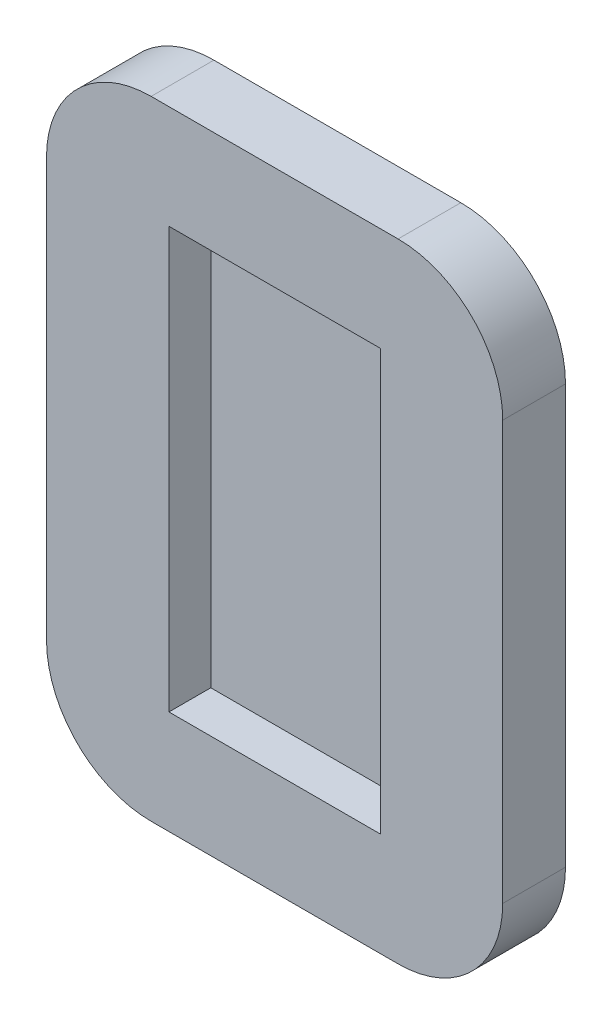
ISO-10303-21;
HEADER;
FILE_DESCRIPTION(('STEP AP214'),'2;1');
FILE_NAME('part.step','',(''),(''),'','','');
FILE_SCHEMA(('AUTOMOTIVE_DESIGN { 1 0 10303 214 1 1 1 1 }'));
ENDSEC;
DATA;
#1=APPLICATION_CONTEXT('core data for automotive mechanical design processes');
#2=APPLICATION_PROTOCOL_DEFINITION('international standard','automotive_design',2000,#1);
#3=PRODUCT_CONTEXT('',#1,'mechanical');
#4=PRODUCT('Part','Part','',(#3));
#5=PRODUCT_RELATED_PRODUCT_CATEGORY('part','',(#4));
#6=PRODUCT_DEFINITION_FORMATION('','',#4);
#7=PRODUCT_DEFINITION_CONTEXT('part definition',#1,'design');
#8=PRODUCT_DEFINITION('design','',#6,#7);
#9=PRODUCT_DEFINITION_SHAPE('','',#8);
#10=(LENGTH_UNIT() NAMED_UNIT(*) SI_UNIT(.MILLI.,.METRE.));
#11=(NAMED_UNIT(*) PLANE_ANGLE_UNIT() SI_UNIT($,.RADIAN.));
#12=(NAMED_UNIT(*) SI_UNIT($,.STERADIAN.) SOLID_ANGLE_UNIT());
#13=UNCERTAINTY_MEASURE_WITH_UNIT(LENGTH_MEASURE(1.E-05),#10,'distance_accuracy_value','');
#14=(GEOMETRIC_REPRESENTATION_CONTEXT(3) GLOBAL_UNCERTAINTY_ASSIGNED_CONTEXT((#13)) GLOBAL_UNIT_ASSIGNED_CONTEXT((#10,
#11,#12)) REPRESENTATION_CONTEXT('',''));
#15=CARTESIAN_POINT('',(0.,0.,0.));
#16=DIRECTION('',(0.,0.,1.));
#17=DIRECTION('',(1.,0.,0.));
#18=AXIS2_PLACEMENT_3D('',#15,#16,#17);
#19=CARTESIAN_POINT('',(21.8,0.,0.));
#20=DIRECTION('',(0.,-1.,0.));
#21=DIRECTION('',(0.,0.,-1.));
#22=AXIS2_PLACEMENT_3D('',#19,#20,#21);
#23=PLANE('',#22);
#24=DIRECTION('',(0.,0.,1.));
#25=VECTOR('',#24,1.);
#26=CARTESIAN_POINT('',(16.8,0.,0.));
#27=LINE('',#26,#25);
#28=CARTESIAN_POINT('',(16.8,0.,21.8));
#29=VERTEX_POINT('',#28);
#30=CARTESIAN_POINT('',(16.8,0.,18.8));
#31=VERTEX_POINT('',#30);
#32=EDGE_CURVE('E50',#29,#31,#27,.F.);
#33=ORIENTED_EDGE('',*,*,#32,.T.);
#34=DIRECTION('',(-1.,0.,0.));
#35=VECTOR('',#34,1.);
#36=CARTESIAN_POINT('',(57.2039545813741,0.,18.8));
#37=LINE('',#36,#35);
#38=CARTESIAN_POINT('',(5.,0.,18.8));
#39=VERTEX_POINT('',#38);
#40=EDGE_CURVE('E139',#31,#39,#37,.T.);
#41=ORIENTED_EDGE('',*,*,#40,.T.);
#42=DIRECTION('',(0.,0.,1.));
#43=VECTOR('',#42,1.);
#44=CARTESIAN_POINT('',(5.,0.,0.));
#45=LINE('',#44,#43);
#46=CARTESIAN_POINT('',(5.,0.,21.8));
#47=VERTEX_POINT('',#46);
#48=EDGE_CURVE('E171',#39,#47,#45,.T.);
#49=ORIENTED_EDGE('',*,*,#48,.T.);
#50=DIRECTION('',(-1.,0.,0.));
#51=VECTOR('',#50,1.);
#52=CARTESIAN_POINT('',(21.8,0.,21.8));
#53=LINE('',#52,#51);
#54=EDGE_CURVE('E181',#29,#47,#53,.T.);
#55=ORIENTED_EDGE('',*,*,#54,.F.);
#56=EDGE_LOOP('',(#33,#41,#49,#55));
#57=FACE_BOUND('',#56,.T.);
#58=ADVANCED_FACE('F41',(#57),#23,.F.);
#59=CARTESIAN_POINT('',(21.8,-30.,0.));
#60=DIRECTION('',(0.,-1.,0.));
#61=DIRECTION('',(0.,0.,-1.));
#62=AXIS2_PLACEMENT_3D('',#59,#60,#61);
#63=PLANE('',#62);
#64=DIRECTION('',(-1.,0.,0.));
#65=VECTOR('',#64,1.);
#66=CARTESIAN_POINT('',(57.2039545813741,-30.,18.8));
#67=LINE('',#66,#65);
#68=CARTESIAN_POINT('',(16.8,-30.,18.8));
#69=VERTEX_POINT('',#68);
#70=CARTESIAN_POINT('',(5.,-30.,18.8));
#71=VERTEX_POINT('',#70);
#72=EDGE_CURVE('E140',#69,#71,#67,.T.);
#73=ORIENTED_EDGE('',*,*,#72,.F.);
#74=DIRECTION('',(0.,0.,1.));
#75=VECTOR('',#74,1.);
#76=CARTESIAN_POINT('',(16.8,-30.,0.));
#77=LINE('',#76,#75);
#78=CARTESIAN_POINT('',(16.8,-30.,21.8));
#79=VERTEX_POINT('',#78);
#80=EDGE_CURVE('E148',#69,#79,#77,.T.);
#81=ORIENTED_EDGE('',*,*,#80,.T.);
#82=DIRECTION('',(-1.,0.,0.));
#83=VECTOR('',#82,1.);
#84=CARTESIAN_POINT('',(21.8,-30.,21.8));
#85=LINE('',#84,#83);
#86=CARTESIAN_POINT('',(5.,-30.,21.8));
#87=VERTEX_POINT('',#86);
#88=EDGE_CURVE('E239',#79,#87,#85,.T.);
#89=ORIENTED_EDGE('',*,*,#88,.T.);
#90=DIRECTION('',(0.,0.,1.));
#91=VECTOR('',#90,1.);
#92=CARTESIAN_POINT('',(5.,-30.,0.));
#93=LINE('',#92,#91);
#94=EDGE_CURVE('E248',#87,#71,#93,.F.);
#95=ORIENTED_EDGE('',*,*,#94,.T.);
#96=EDGE_LOOP('',(#73,#81,#89,#95));
#97=FACE_BOUND('',#96,.T.);
#98=ADVANCED_FACE('F268',(#97),#63,.T.);
#99=CARTESIAN_POINT('',(21.8,0.,21.8));
#100=DIRECTION('',(0.,0.,-1.));
#101=DIRECTION('',(0.,1.,0.));
#102=AXIS2_PLACEMENT_3D('',#99,#100,#101);
#103=PLANE('',#102);
#104=DIRECTION('',(-1.,0.,0.));
#105=VECTOR('',#104,1.);
#106=CARTESIAN_POINT('',(5.84999999999999,-4.95,21.8));
#107=LINE('',#106,#105);
#108=CARTESIAN_POINT('',(15.95,-4.95,21.8));
#109=VERTEX_POINT('',#108);
#110=CARTESIAN_POINT('',(5.84999999999999,-4.95,21.8));
#111=VERTEX_POINT('',#110);
#112=EDGE_CURVE('E214',#109,#111,#107,.T.);
#113=ORIENTED_EDGE('',*,*,#112,.F.);
#114=DIRECTION('',(0.,1.,0.));
#115=VECTOR('',#114,1.);
#116=CARTESIAN_POINT('',(15.95,-4.95,21.8));
#117=LINE('',#116,#115);
#118=CARTESIAN_POINT('',(15.95,-25.05,21.8));
#119=VERTEX_POINT('',#118);
#120=EDGE_CURVE('E64',#119,#109,#117,.T.);
#121=ORIENTED_EDGE('',*,*,#120,.F.);
#122=DIRECTION('',(1.,0.,0.));
#123=VECTOR('',#122,1.);
#124=CARTESIAN_POINT('',(5.84999999999999,-25.05,21.8));
#125=LINE('',#124,#123);
#126=CARTESIAN_POINT('',(5.84999999999999,-25.05,21.8));
#127=VERTEX_POINT('',#126);
#128=EDGE_CURVE('E199',#127,#119,#125,.T.);
#129=ORIENTED_EDGE('',*,*,#128,.F.);
#130=DIRECTION('',(0.,-1.,0.));
#131=VECTOR('',#130,1.);
#132=CARTESIAN_POINT('',(5.84999999999999,-4.95,21.8));
#133=LINE('',#132,#131);
#134=EDGE_CURVE('E218',#111,#127,#133,.T.);
#135=ORIENTED_EDGE('',*,*,#134,.F.);
#136=EDGE_LOOP('',(#113,#121,#129,#135));
#137=FACE_BOUND('',#136,.T.);
#138=ORIENTED_EDGE('',*,*,#88,.F.);
#139=CARTESIAN_POINT('',(16.8,-25.,21.8));
#140=DIRECTION('',(0.,0.,-1.));
#141=DIRECTION('',(0.,1.,0.));
#142=AXIS2_PLACEMENT_3D('',#139,#140,#141);
#143=CIRCLE('',#142,5.);
#144=CARTESIAN_POINT('',(21.8,-25.,21.8));
#145=VERTEX_POINT('',#144);
#146=EDGE_CURVE('E165',#79,#145,#143,.F.);
#147=ORIENTED_EDGE('',*,*,#146,.T.);
#148=DIRECTION('',(0.,-1.,0.));
#149=VECTOR('',#148,1.);
#150=CARTESIAN_POINT('',(21.8,0.,21.8));
#151=LINE('',#150,#149);
#152=CARTESIAN_POINT('',(21.8,-5.,21.8));
#153=VERTEX_POINT('',#152);
#154=EDGE_CURVE('E155',#153,#145,#151,.T.);
#155=ORIENTED_EDGE('',*,*,#154,.F.);
#156=CARTESIAN_POINT('',(16.8,-5.,21.8));
#157=DIRECTION('',(0.,0.,-1.));
#158=DIRECTION('',(0.,1.,0.));
#159=AXIS2_PLACEMENT_3D('',#156,#157,#158);
#160=CIRCLE('',#159,5.);
#161=EDGE_CURVE('E185',#153,#29,#160,.F.);
#162=ORIENTED_EDGE('',*,*,#161,.T.);
#163=ORIENTED_EDGE('',*,*,#54,.T.);
#164=CARTESIAN_POINT('',(5.,-5.,21.8));
#165=DIRECTION('',(0.,0.,-1.));
#166=DIRECTION('',(0.,1.,0.));
#167=AXIS2_PLACEMENT_3D('',#164,#165,#166);
#168=CIRCLE('',#167,5.);
#169=CARTESIAN_POINT('',(0.,-5.,21.8));
#170=VERTEX_POINT('',#169);
#171=EDGE_CURVE('E254',#47,#170,#168,.F.);
#172=ORIENTED_EDGE('',*,*,#171,.T.);
#173=DIRECTION('',(0.,-1.,0.));
#174=VECTOR('',#173,1.);
#175=CARTESIAN_POINT('',(0.,0.,21.8));
#176=LINE('',#175,#174);
#177=CARTESIAN_POINT('',(0.,-25.,21.8));
#178=VERTEX_POINT('',#177);
#179=EDGE_CURVE('E228',#170,#178,#176,.T.);
#180=ORIENTED_EDGE('',*,*,#179,.T.);
#181=CARTESIAN_POINT('',(5.,-25.,21.8));
#182=DIRECTION('',(0.,0.,-1.));
#183=DIRECTION('',(0.,1.,0.));
#184=AXIS2_PLACEMENT_3D('',#181,#182,#183);
#185=CIRCLE('',#184,5.);
#186=EDGE_CURVE('E259',#178,#87,#185,.F.);
#187=ORIENTED_EDGE('',*,*,#186,.T.);
#188=EDGE_LOOP('',(#138,#147,#155,#162,#163,#172,#180,#187));
#189=FACE_BOUND('',#188,.T.);
#190=ADVANCED_FACE('F264',(#137,#189),#103,.F.);
#191=CARTESIAN_POINT('',(21.8,0.,0.));
#192=DIRECTION('',(1.,0.,0.));
#193=DIRECTION('',(0.,0.,-1.));
#194=AXIS2_PLACEMENT_3D('',#191,#192,#193);
#195=PLANE('',#194);
#196=DIRECTION('',(0.,1.,0.));
#197=VECTOR('',#196,1.);
#198=CARTESIAN_POINT('',(21.8,0.,18.8));
#199=LINE('',#198,#197);
#200=CARTESIAN_POINT('',(21.8,-25.,18.8));
#201=VERTEX_POINT('',#200);
#202=CARTESIAN_POINT('',(21.8,-5.,18.8));
#203=VERTEX_POINT('',#202);
#204=EDGE_CURVE('E128',#201,#203,#199,.T.);
#205=ORIENTED_EDGE('',*,*,#204,.T.);
#206=DIRECTION('',(0.,0.,1.));
#207=VECTOR('',#206,1.);
#208=CARTESIAN_POINT('',(21.8,-5.,21.8));
#209=LINE('',#208,#207);
#210=EDGE_CURVE('E158',#203,#153,#209,.T.);
#211=ORIENTED_EDGE('',*,*,#210,.T.);
#212=ORIENTED_EDGE('',*,*,#154,.T.);
#213=DIRECTION('',(0.,0.,1.));
#214=VECTOR('',#213,1.);
#215=CARTESIAN_POINT('',(21.8,-25.,0.));
#216=LINE('',#215,#214);
#217=EDGE_CURVE('E147',#145,#201,#216,.F.);
#218=ORIENTED_EDGE('',*,*,#217,.T.);
#219=EDGE_LOOP('',(#205,#211,#212,#218));
#220=FACE_BOUND('',#219,.T.);
#221=ADVANCED_FACE('F153',(#220),#195,.T.);
#222=CARTESIAN_POINT('',(0.,0.,0.));
#223=DIRECTION('',(1.,0.,0.));
#224=DIRECTION('',(0.,0.,-1.));
#225=AXIS2_PLACEMENT_3D('',#222,#223,#224);
#226=PLANE('',#225);
#227=DIRECTION('',(0.,0.,1.));
#228=VECTOR('',#227,1.);
#229=CARTESIAN_POINT('',(0.,-5.,0.));
#230=LINE('',#229,#228);
#231=CARTESIAN_POINT('',(0.,-5.,18.8));
#232=VERTEX_POINT('',#231);
#233=EDGE_CURVE('E157',#170,#232,#230,.F.);
#234=ORIENTED_EDGE('',*,*,#233,.T.);
#235=DIRECTION('',(0.,1.,0.));
#236=VECTOR('',#235,1.);
#237=CARTESIAN_POINT('',(0.,0.,18.8));
#238=LINE('',#237,#236);
#239=CARTESIAN_POINT('',(0.,-25.,18.8));
#240=VERTEX_POINT('',#239);
#241=EDGE_CURVE('E56',#240,#232,#238,.T.);
#242=ORIENTED_EDGE('',*,*,#241,.F.);
#243=DIRECTION('',(0.,0.,1.));
#244=VECTOR('',#243,1.);
#245=CARTESIAN_POINT('',(0.,-25.,21.8));
#246=LINE('',#245,#244);
#247=EDGE_CURVE('E163',#240,#178,#246,.T.);
#248=ORIENTED_EDGE('',*,*,#247,.T.);
#249=ORIENTED_EDGE('',*,*,#179,.F.);
#250=EDGE_LOOP('',(#234,#242,#248,#249));
#251=FACE_BOUND('',#250,.T.);
#252=ADVANCED_FACE('F274',(#251),#226,.F.);
#253=CARTESIAN_POINT('',(16.8,-25.,0.));
#254=DIRECTION('',(0.,0.,1.));
#255=DIRECTION('',(0.,-1.,0.));
#256=AXIS2_PLACEMENT_3D('',#253,#254,#255);
#257=CYLINDRICAL_SURFACE('',#256,5.);
#258=CARTESIAN_POINT('',(16.8,-25.,18.8));
#259=DIRECTION('',(0.,0.,1.));
#260=DIRECTION('',(0.,-1.,0.));
#261=AXIS2_PLACEMENT_3D('',#258,#259,#260);
#262=CIRCLE('',#261,5.);
#263=EDGE_CURVE('E131',#201,#69,#262,.F.);
#264=ORIENTED_EDGE('',*,*,#263,.F.);
#265=ORIENTED_EDGE('',*,*,#217,.F.);
#266=ORIENTED_EDGE('',*,*,#146,.F.);
#267=ORIENTED_EDGE('',*,*,#80,.F.);
#268=EDGE_LOOP('',(#264,#265,#266,#267));
#269=FACE_BOUND('',#268,.T.);
#270=ADVANCED_FACE('F145',(#269),#257,.T.);
#271=CARTESIAN_POINT('',(5.,-25.,0.));
#272=DIRECTION('',(0.,0.,-1.));
#273=DIRECTION('',(0.,1.,0.));
#274=AXIS2_PLACEMENT_3D('',#271,#272,#273);
#275=CYLINDRICAL_SURFACE('',#274,5.);
#276=CARTESIAN_POINT('',(5.,-25.,18.8));
#277=DIRECTION('',(0.,0.,1.));
#278=DIRECTION('',(0.,-1.,0.));
#279=AXIS2_PLACEMENT_3D('',#276,#277,#278);
#280=CIRCLE('',#279,5.);
#281=EDGE_CURVE('E150',#71,#240,#280,.F.);
#282=ORIENTED_EDGE('',*,*,#281,.F.);
#283=ORIENTED_EDGE('',*,*,#94,.F.);
#284=ORIENTED_EDGE('',*,*,#186,.F.);
#285=ORIENTED_EDGE('',*,*,#247,.F.);
#286=EDGE_LOOP('',(#282,#283,#284,#285));
#287=FACE_BOUND('',#286,.T.);
#288=ADVANCED_FACE('F271',(#287),#275,.T.);
#289=CARTESIAN_POINT('',(16.8,-5.,0.));
#290=DIRECTION('',(0.,0.,-1.));
#291=DIRECTION('',(0.,1.,0.));
#292=AXIS2_PLACEMENT_3D('',#289,#290,#291);
#293=CYLINDRICAL_SURFACE('',#292,5.);
#294=CARTESIAN_POINT('',(16.8,-5.,18.8));
#295=DIRECTION('',(0.,0.,1.));
#296=DIRECTION('',(0.,-1.,0.));
#297=AXIS2_PLACEMENT_3D('',#294,#295,#296);
#298=CIRCLE('',#297,5.);
#299=EDGE_CURVE('E134',#31,#203,#298,.F.);
#300=ORIENTED_EDGE('',*,*,#299,.F.);
#301=ORIENTED_EDGE('',*,*,#32,.F.);
#302=ORIENTED_EDGE('',*,*,#161,.F.);
#303=ORIENTED_EDGE('',*,*,#210,.F.);
#304=EDGE_LOOP('',(#300,#301,#302,#303));
#305=FACE_BOUND('',#304,.T.);
#306=ADVANCED_FACE('F184',(#305),#293,.T.);
#307=CARTESIAN_POINT('',(5.,-5.,0.));
#308=DIRECTION('',(0.,0.,1.));
#309=DIRECTION('',(0.,-1.,0.));
#310=AXIS2_PLACEMENT_3D('',#307,#308,#309);
#311=CYLINDRICAL_SURFACE('',#310,5.);
#312=CARTESIAN_POINT('',(5.,-5.,18.8));
#313=DIRECTION('',(0.,0.,1.));
#314=DIRECTION('',(0.,-1.,0.));
#315=AXIS2_PLACEMENT_3D('',#312,#313,#314);
#316=CIRCLE('',#315,5.);
#317=EDGE_CURVE('E11',#232,#39,#316,.F.);
#318=ORIENTED_EDGE('',*,*,#317,.F.);
#319=ORIENTED_EDGE('',*,*,#233,.F.);
#320=ORIENTED_EDGE('',*,*,#171,.F.);
#321=ORIENTED_EDGE('',*,*,#48,.F.);
#322=EDGE_LOOP('',(#318,#319,#320,#321));
#323=FACE_BOUND('',#322,.T.);
#324=ADVANCED_FACE('F43',(#323),#311,.T.);
#325=CARTESIAN_POINT('',(15.95,-4.95,19.8));
#326=DIRECTION('',(1.,0.,0.));
#327=DIRECTION('',(0.,0.,-1.));
#328=AXIS2_PLACEMENT_3D('',#325,#326,#327);
#329=PLANE('',#328);
#330=ORIENTED_EDGE('',*,*,#120,.T.);
#331=DIRECTION('',(0.,0.,1.));
#332=VECTOR('',#331,1.);
#333=CARTESIAN_POINT('',(15.95,-4.95,19.8));
#334=LINE('',#333,#332);
#335=CARTESIAN_POINT('',(15.95,-4.95,19.8));
#336=VERTEX_POINT('',#335);
#337=EDGE_CURVE('E211',#336,#109,#334,.T.);
#338=ORIENTED_EDGE('',*,*,#337,.F.);
#339=DIRECTION('',(0.,1.,0.));
#340=VECTOR('',#339,1.);
#341=CARTESIAN_POINT('',(15.95,-4.95,19.8));
#342=LINE('',#341,#340);
#343=CARTESIAN_POINT('',(15.95,-25.05,19.8));
#344=VERTEX_POINT('',#343);
#345=EDGE_CURVE('E194',#344,#336,#342,.T.);
#346=ORIENTED_EDGE('',*,*,#345,.F.);
#347=DIRECTION('',(0.,0.,1.));
#348=VECTOR('',#347,1.);
#349=CARTESIAN_POINT('',(15.95,-25.05,19.8));
#350=LINE('',#349,#348);
#351=EDGE_CURVE('E225',#344,#119,#350,.T.);
#352=ORIENTED_EDGE('',*,*,#351,.T.);
#353=EDGE_LOOP('',(#330,#338,#346,#352));
#354=FACE_BOUND('',#353,.T.);
#355=ADVANCED_FACE('F283',(#354),#329,.F.);
#356=CARTESIAN_POINT('',(5.84999999999999,-25.05,19.8));
#357=DIRECTION('',(0.,-1.,0.));
#358=DIRECTION('',(0.,0.,-1.));
#359=AXIS2_PLACEMENT_3D('',#356,#357,#358);
#360=PLANE('',#359);
#361=ORIENTED_EDGE('',*,*,#128,.T.);
#362=ORIENTED_EDGE('',*,*,#351,.F.);
#363=DIRECTION('',(1.,0.,0.));
#364=VECTOR('',#363,1.);
#365=CARTESIAN_POINT('',(5.84999999999999,-25.05,19.8));
#366=LINE('',#365,#364);
#367=CARTESIAN_POINT('',(5.84999999999999,-25.05,19.8));
#368=VERTEX_POINT('',#367);
#369=EDGE_CURVE('E207',#368,#344,#366,.T.);
#370=ORIENTED_EDGE('',*,*,#369,.F.);
#371=DIRECTION('',(0.,0.,1.));
#372=VECTOR('',#371,1.);
#373=CARTESIAN_POINT('',(5.84999999999999,-25.05,19.8));
#374=LINE('',#373,#372);
#375=EDGE_CURVE('E229',#368,#127,#374,.T.);
#376=ORIENTED_EDGE('',*,*,#375,.T.);
#377=EDGE_LOOP('',(#361,#362,#370,#376));
#378=FACE_BOUND('',#377,.T.);
#379=ADVANCED_FACE('F288',(#378),#360,.F.);
#380=CARTESIAN_POINT('',(5.84999999999999,-4.95,19.8));
#381=DIRECTION('',(-1.,0.,0.));
#382=DIRECTION('',(0.,0.,1.));
#383=AXIS2_PLACEMENT_3D('',#380,#381,#382);
#384=PLANE('',#383);
#385=ORIENTED_EDGE('',*,*,#134,.T.);
#386=ORIENTED_EDGE('',*,*,#375,.F.);
#387=DIRECTION('',(0.,-1.,0.));
#388=VECTOR('',#387,1.);
#389=CARTESIAN_POINT('',(5.84999999999999,-4.95,19.8));
#390=LINE('',#389,#388);
#391=CARTESIAN_POINT('',(5.84999999999999,-4.95,19.8));
#392=VERTEX_POINT('',#391);
#393=EDGE_CURVE('E203',#392,#368,#390,.T.);
#394=ORIENTED_EDGE('',*,*,#393,.F.);
#395=DIRECTION('',(0.,0.,1.));
#396=VECTOR('',#395,1.);
#397=CARTESIAN_POINT('',(5.84999999999999,-4.95,19.8));
#398=LINE('',#397,#396);
#399=EDGE_CURVE('E232',#392,#111,#398,.T.);
#400=ORIENTED_EDGE('',*,*,#399,.T.);
#401=EDGE_LOOP('',(#385,#386,#394,#400));
#402=FACE_BOUND('',#401,.T.);
#403=ADVANCED_FACE('F340',(#402),#384,.F.);
#404=CARTESIAN_POINT('',(5.84999999999999,-4.95,19.8));
#405=DIRECTION('',(0.,1.,0.));
#406=DIRECTION('',(0.,0.,1.));
#407=AXIS2_PLACEMENT_3D('',#404,#405,#406);
#408=PLANE('',#407);
#409=ORIENTED_EDGE('',*,*,#112,.T.);
#410=ORIENTED_EDGE('',*,*,#399,.F.);
#411=DIRECTION('',(-1.,0.,0.));
#412=VECTOR('',#411,1.);
#413=CARTESIAN_POINT('',(5.84999999999999,-4.95,19.8));
#414=LINE('',#413,#412);
#415=EDGE_CURVE('E198',#336,#392,#414,.T.);
#416=ORIENTED_EDGE('',*,*,#415,.F.);
#417=ORIENTED_EDGE('',*,*,#337,.T.);
#418=EDGE_LOOP('',(#409,#410,#416,#417));
#419=FACE_BOUND('',#418,.T.);
#420=ADVANCED_FACE('F333',(#419),#408,.F.);
#421=CARTESIAN_POINT('',(0.,0.,19.8));
#422=DIRECTION('',(0.,0.,1.));
#423=DIRECTION('',(1.,0.,0.));
#424=AXIS2_PLACEMENT_3D('',#421,#422,#423);
#425=PLANE('',#424);
#426=ORIENTED_EDGE('',*,*,#345,.T.);
#427=ORIENTED_EDGE('',*,*,#415,.T.);
#428=ORIENTED_EDGE('',*,*,#393,.T.);
#429=ORIENTED_EDGE('',*,*,#369,.T.);
#430=EDGE_LOOP('',(#426,#427,#428,#429));
#431=FACE_BOUND('',#430,.T.);
#432=ADVANCED_FACE('F323',(#431),#425,.T.);
#433=CARTESIAN_POINT('',(57.2039545813741,0.,18.8));
#434=DIRECTION('',(0.,0.,1.));
#435=DIRECTION('',(0.,-1.,0.));
#436=AXIS2_PLACEMENT_3D('',#433,#434,#435);
#437=PLANE('',#436);
#438=ORIENTED_EDGE('',*,*,#263,.T.);
#439=ORIENTED_EDGE('',*,*,#72,.T.);
#440=ORIENTED_EDGE('',*,*,#281,.T.);
#441=ORIENTED_EDGE('',*,*,#241,.T.);
#442=ORIENTED_EDGE('',*,*,#317,.T.);
#443=ORIENTED_EDGE('',*,*,#40,.F.);
#444=ORIENTED_EDGE('',*,*,#299,.T.);
#445=ORIENTED_EDGE('',*,*,#204,.F.);
#446=EDGE_LOOP('',(#438,#439,#440,#441,#442,#443,#444,#445));
#447=FACE_BOUND('',#446,.T.);
#448=ADVANCED_FACE('F130',(#447),#437,.F.);
#449=CLOSED_SHELL('',(#58,#98,#190,#221,#252,#270,#288,#306,#324,#355,#379,#403,#420,#432,#448));
#450=MANIFOLD_SOLID_BREP('B2',#449);
#451=ADVANCED_BREP_SHAPE_REPRESENTATION('',(#18,#450),#14);
#452=SHAPE_DEFINITION_REPRESENTATION(#9,#451);
ENDSEC;
END-ISO-10303-21;
